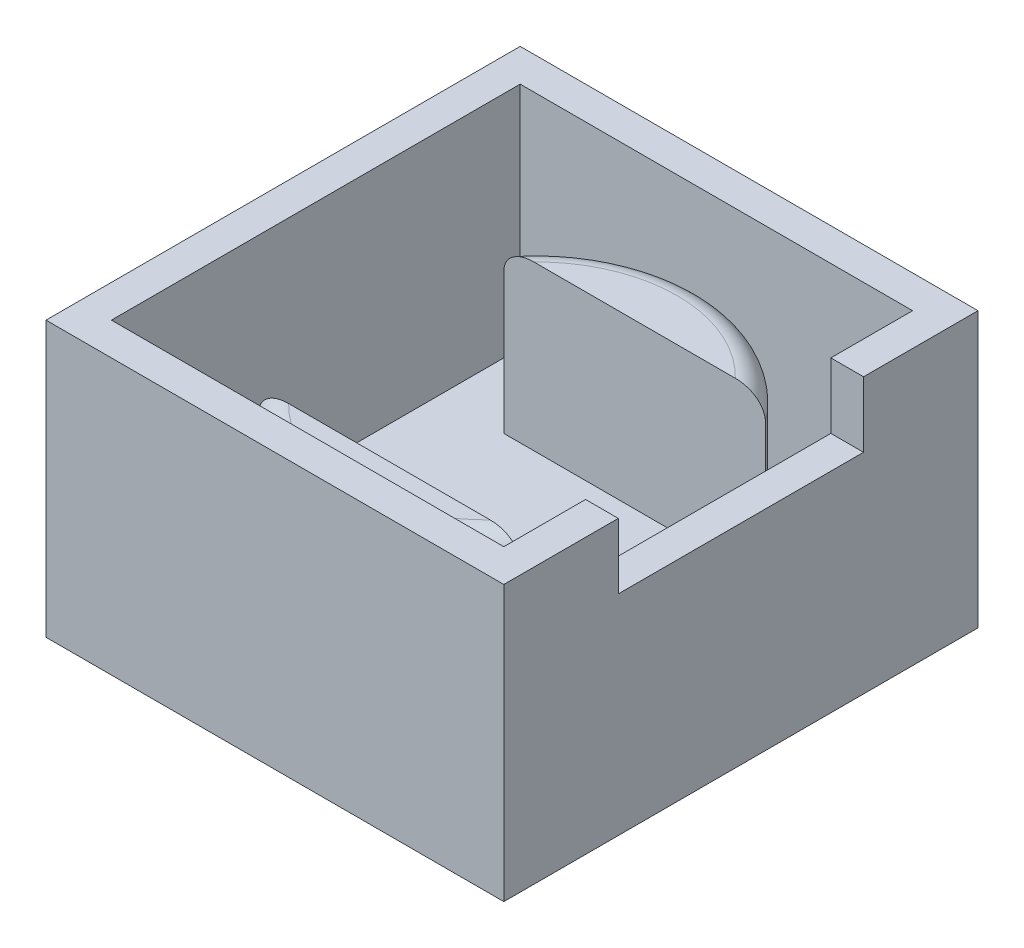
ISO-10303-21;
HEADER;
FILE_DESCRIPTION(('STEP AP214'),'2;1');
FILE_NAME('part.step','',(''),(''),'','','');
FILE_SCHEMA(('AUTOMOTIVE_DESIGN { 1 0 10303 214 1 1 1 1 }'));
ENDSEC;
DATA;
#1=APPLICATION_CONTEXT('core data for automotive mechanical design processes');
#2=APPLICATION_PROTOCOL_DEFINITION('international standard','automotive_design',2000,#1);
#3=PRODUCT_CONTEXT('',#1,'mechanical');
#4=PRODUCT('Part','Part','',(#3));
#5=PRODUCT_RELATED_PRODUCT_CATEGORY('part','',(#4));
#6=PRODUCT_DEFINITION_FORMATION('','',#4);
#7=PRODUCT_DEFINITION_CONTEXT('part definition',#1,'design');
#8=PRODUCT_DEFINITION('design','',#6,#7);
#9=PRODUCT_DEFINITION_SHAPE('','',#8);
#10=(LENGTH_UNIT() NAMED_UNIT(*) SI_UNIT(.MILLI.,.METRE.));
#11=(NAMED_UNIT(*) PLANE_ANGLE_UNIT() SI_UNIT($,.RADIAN.));
#12=(NAMED_UNIT(*) SI_UNIT($,.STERADIAN.) SOLID_ANGLE_UNIT());
#13=UNCERTAINTY_MEASURE_WITH_UNIT(LENGTH_MEASURE(1.E-05),#10,'distance_accuracy_value','');
#14=(GEOMETRIC_REPRESENTATION_CONTEXT(3) GLOBAL_UNCERTAINTY_ASSIGNED_CONTEXT((#13)) GLOBAL_UNIT_ASSIGNED_CONTEXT((#10,
#11,#12)) REPRESENTATION_CONTEXT('',''));
#15=CARTESIAN_POINT('',(0.,0.,0.));
#16=DIRECTION('',(0.,0.,1.));
#17=DIRECTION('',(1.,0.,0.));
#18=AXIS2_PLACEMENT_3D('',#15,#16,#17);
#19=CARTESIAN_POINT('',(0.,16.256,0.));
#20=DIRECTION('',(0.,-1.,0.));
#21=DIRECTION('',(0.,0.,-1.));
#22=AXIS2_PLACEMENT_3D('',#19,#20,#21);
#23=PLANE('',#22);
#24=DIRECTION('',(-1.,0.,0.));
#25=VECTOR('',#24,1.);
#26=CARTESIAN_POINT('',(66.04,16.256,31.75));
#27=LINE('',#26,#25);
#28=CARTESIAN_POINT('',(68.58,16.256,31.75));
#29=VERTEX_POINT('',#28);
#30=CARTESIAN_POINT('',(66.04,16.256,31.75));
#31=VERTEX_POINT('',#30);
#32=EDGE_CURVE('E54',#29,#31,#27,.T.);
#33=ORIENTED_EDGE('',*,*,#32,.F.);
#34=DIRECTION('',(0.,0.,-1.));
#35=VECTOR('',#34,1.);
#36=CARTESIAN_POINT('',(68.58,16.256,3.80999999999999));
#37=LINE('',#36,#35);
#38=CARTESIAN_POINT('',(68.58,16.256,12.7));
#39=VERTEX_POINT('',#38);
#40=EDGE_CURVE('E220',#29,#39,#37,.T.);
#41=ORIENTED_EDGE('',*,*,#40,.T.);
#42=DIRECTION('',(1.,0.,0.));
#43=VECTOR('',#42,1.);
#44=CARTESIAN_POINT('',(66.04,16.256,12.7));
#45=LINE('',#44,#43);
#46=CARTESIAN_POINT('',(66.0399999999999,16.256,12.7));
#47=VERTEX_POINT('',#46);
#48=EDGE_CURVE('E59',#47,#39,#45,.T.);
#49=ORIENTED_EDGE('',*,*,#48,.F.);
#50=DIRECTION('',(0.,0.,-1.));
#51=VECTOR('',#50,1.);
#52=CARTESIAN_POINT('',(66.04,16.256,38.1));
#53=LINE('',#52,#51);
#54=EDGE_CURVE('E294',#31,#47,#53,.T.);
#55=ORIENTED_EDGE('',*,*,#54,.F.);
#56=EDGE_LOOP('',(#33,#41,#49,#55));
#57=FACE_BOUND('',#56,.T.);
#58=ADVANCED_FACE('F36',(#57),#23,.F.);
#59=CARTESIAN_POINT('',(0.,3.556,0.));
#60=DIRECTION('',(0.,-1.,0.));
#61=DIRECTION('',(0.,0.,-1.));
#62=AXIS2_PLACEMENT_3D('',#59,#60,#61);
#63=PLANE('',#62);
#64=DIRECTION('',(-1.,0.,0.));
#65=VECTOR('',#64,1.);
#66=CARTESIAN_POINT('',(66.04,3.556,31.75));
#67=LINE('',#66,#65);
#68=CARTESIAN_POINT('',(60.96,3.556,31.75));
#69=VERTEX_POINT('',#68);
#70=CARTESIAN_POINT('',(40.64,3.556,31.75));
#71=VERTEX_POINT('',#70);
#72=EDGE_CURVE('E252',#69,#71,#67,.T.);
#73=ORIENTED_EDGE('',*,*,#72,.F.);
#74=CARTESIAN_POINT('',(50.8,3.556,24.13));
#75=DIRECTION('',(0.,1.,0.));
#76=DIRECTION('',(0.,0.,-1.));
#77=AXIS2_PLACEMENT_3D('',#74,#75,#76);
#78=CIRCLE('',#77,12.7);
#79=EDGE_CURVE('E249',#69,#71,#78,.F.);
#80=ORIENTED_EDGE('',*,*,#79,.T.);
#81=EDGE_LOOP('',(#73,#80));
#82=FACE_BOUND('',#81,.T.);
#83=DIRECTION('',(0.,0.,1.));
#84=VECTOR('',#83,1.);
#85=CARTESIAN_POINT('',(35.56,3.556,6.34999999999999));
#86=LINE('',#85,#84);
#87=CARTESIAN_POINT('',(35.56,3.556,6.34999999999999));
#88=VERTEX_POINT('',#87);
#89=CARTESIAN_POINT('',(35.56,3.556,38.1));
#90=VERTEX_POINT('',#89);
#91=EDGE_CURVE('E168',#88,#90,#86,.T.);
#92=ORIENTED_EDGE('',*,*,#91,.T.);
#93=DIRECTION('',(1.,0.,0.));
#94=VECTOR('',#93,1.);
#95=CARTESIAN_POINT('',(35.56,3.556,38.1));
#96=LINE('',#95,#94);
#97=CARTESIAN_POINT('',(66.04,3.556,38.1));
#98=VERTEX_POINT('',#97);
#99=EDGE_CURVE('E290',#90,#98,#96,.T.);
#100=ORIENTED_EDGE('',*,*,#99,.T.);
#101=DIRECTION('',(0.,0.,-1.));
#102=VECTOR('',#101,1.);
#103=CARTESIAN_POINT('',(66.04,3.556,10.922));
#104=LINE('',#103,#102);
#105=CARTESIAN_POINT('',(66.04,3.556,6.34999999999999));
#106=VERTEX_POINT('',#105);
#107=EDGE_CURVE('E400',#98,#106,#104,.T.);
#108=ORIENTED_EDGE('',*,*,#107,.T.);
#109=DIRECTION('',(-1.,0.,0.));
#110=VECTOR('',#109,1.);
#111=CARTESIAN_POINT('',(66.04,3.556,6.34999999999999));
#112=LINE('',#111,#110);
#113=EDGE_CURVE('E399',#106,#88,#112,.T.);
#114=ORIENTED_EDGE('',*,*,#113,.T.);
#115=EDGE_LOOP('',(#92,#100,#108,#114));
#116=FACE_BOUND('',#115,.T.);
#117=CARTESIAN_POINT('',(50.8,3.556,20.32));
#118=DIRECTION('',(0.,1.,0.));
#119=DIRECTION('',(0.,0.,-1.));
#120=AXIS2_PLACEMENT_3D('',#117,#118,#119);
#121=CIRCLE('',#120,12.7);
#122=CARTESIAN_POINT('',(60.96,3.556,12.7));
#123=VERTEX_POINT('',#122);
#124=CARTESIAN_POINT('',(40.64,3.556,12.7));
#125=VERTEX_POINT('',#124);
#126=EDGE_CURVE('E282',#123,#125,#121,.T.);
#127=ORIENTED_EDGE('',*,*,#126,.F.);
#128=DIRECTION('',(-1.,0.,0.));
#129=VECTOR('',#128,1.);
#130=CARTESIAN_POINT('',(66.04,3.556,12.7));
#131=LINE('',#130,#129);
#132=EDGE_CURVE('E277',#123,#125,#131,.T.);
#133=ORIENTED_EDGE('',*,*,#132,.T.);
#134=EDGE_LOOP('',(#127,#133));
#135=FACE_BOUND('',#134,.T.);
#136=ADVANCED_FACE('F326',(#82,#116,#135),#63,.F.);
#137=CARTESIAN_POINT('',(35.56,16.256,38.1));
#138=DIRECTION('',(0.,0.,-1.));
#139=DIRECTION('',(-1.,0.,0.));
#140=AXIS2_PLACEMENT_3D('',#137,#138,#139);
#141=PLANE('',#140);
#142=ORIENTED_EDGE('',*,*,#99,.F.);
#143=DIRECTION('',(0.,-1.,0.));
#144=VECTOR('',#143,1.);
#145=CARTESIAN_POINT('',(35.56,16.256,38.1));
#146=LINE('',#145,#144);
#147=CARTESIAN_POINT('',(35.56,21.336,38.1));
#148=VERTEX_POINT('',#147);
#149=EDGE_CURVE('E173',#148,#90,#146,.T.);
#150=ORIENTED_EDGE('',*,*,#149,.F.);
#151=DIRECTION('',(-1.,0.,0.));
#152=VECTOR('',#151,1.);
#153=CARTESIAN_POINT('',(35.56,21.336,38.1));
#154=LINE('',#153,#152);
#155=CARTESIAN_POINT('',(66.04,21.336,38.1));
#156=VERTEX_POINT('',#155);
#157=EDGE_CURVE('E186',#156,#148,#154,.T.);
#158=ORIENTED_EDGE('',*,*,#157,.F.);
#159=DIRECTION('',(0.,-1.,0.));
#160=VECTOR('',#159,1.);
#161=CARTESIAN_POINT('',(66.04,16.256,38.1));
#162=LINE('',#161,#160);
#163=EDGE_CURVE('E392',#156,#98,#162,.T.);
#164=ORIENTED_EDGE('',*,*,#163,.T.);
#165=EDGE_LOOP('',(#142,#150,#158,#164));
#166=FACE_BOUND('',#165,.T.);
#167=ADVANCED_FACE('F322',(#166),#141,.T.);
#168=CARTESIAN_POINT('',(66.04,16.256,10.922));
#169=DIRECTION('',(-1.,0.,0.));
#170=DIRECTION('',(0.,0.,1.));
#171=AXIS2_PLACEMENT_3D('',#168,#169,#170);
#172=PLANE('',#171);
#173=ORIENTED_EDGE('',*,*,#107,.F.);
#174=ORIENTED_EDGE('',*,*,#163,.F.);
#175=DIRECTION('',(0.,0.,1.));
#176=VECTOR('',#175,1.);
#177=CARTESIAN_POINT('',(66.04,21.336,31.75));
#178=LINE('',#177,#176);
#179=CARTESIAN_POINT('',(66.04,21.336,31.75));
#180=VERTEX_POINT('',#179);
#181=EDGE_CURVE('E209',#180,#156,#178,.T.);
#182=ORIENTED_EDGE('',*,*,#181,.F.);
#183=DIRECTION('',(0.,-1.,0.));
#184=VECTOR('',#183,1.);
#185=CARTESIAN_POINT('',(66.04,21.336,31.75));
#186=LINE('',#185,#184);
#187=EDGE_CURVE('E212',#180,#31,#186,.T.);
#188=ORIENTED_EDGE('',*,*,#187,.T.);
#189=ORIENTED_EDGE('',*,*,#54,.T.);
#190=DIRECTION('',(0.,-1.,0.));
#191=VECTOR('',#190,1.);
#192=CARTESIAN_POINT('',(66.04,21.336,12.7));
#193=LINE('',#192,#191);
#194=CARTESIAN_POINT('',(66.04,21.336,12.7));
#195=VERTEX_POINT('',#194);
#196=EDGE_CURVE('E225',#195,#47,#193,.T.);
#197=ORIENTED_EDGE('',*,*,#196,.F.);
#198=DIRECTION('',(0.,0.,1.));
#199=VECTOR('',#198,1.);
#200=CARTESIAN_POINT('',(66.04,21.336,6.34999999999999));
#201=LINE('',#200,#199);
#202=CARTESIAN_POINT('',(66.04,21.336,6.34999999999999));
#203=VERTEX_POINT('',#202);
#204=EDGE_CURVE('E180',#203,#195,#201,.T.);
#205=ORIENTED_EDGE('',*,*,#204,.F.);
#206=DIRECTION('',(0.,-1.,0.));
#207=VECTOR('',#206,1.);
#208=CARTESIAN_POINT('',(66.04,16.256,6.34999999999999));
#209=LINE('',#208,#207);
#210=EDGE_CURVE('E172',#203,#106,#209,.T.);
#211=ORIENTED_EDGE('',*,*,#210,.T.);
#212=EDGE_LOOP('',(#173,#174,#182,#188,#189,#197,#205,#211));
#213=FACE_BOUND('',#212,.T.);
#214=ADVANCED_FACE('F319',(#213),#172,.T.);
#215=CARTESIAN_POINT('',(66.04,16.256,6.34999999999999));
#216=DIRECTION('',(0.,0.,1.));
#217=DIRECTION('',(1.,0.,0.));
#218=AXIS2_PLACEMENT_3D('',#215,#216,#217);
#219=PLANE('',#218);
#220=ORIENTED_EDGE('',*,*,#113,.F.);
#221=ORIENTED_EDGE('',*,*,#210,.F.);
#222=DIRECTION('',(1.,0.,0.));
#223=VECTOR('',#222,1.);
#224=CARTESIAN_POINT('',(35.56,21.336,6.34999999999999));
#225=LINE('',#224,#223);
#226=CARTESIAN_POINT('',(35.56,21.336,6.34999999999999));
#227=VERTEX_POINT('',#226);
#228=EDGE_CURVE('E176',#227,#203,#225,.T.);
#229=ORIENTED_EDGE('',*,*,#228,.F.);
#230=DIRECTION('',(0.,-1.,0.));
#231=VECTOR('',#230,1.);
#232=CARTESIAN_POINT('',(35.56,16.256,6.34999999999999));
#233=LINE('',#232,#231);
#234=EDGE_CURVE('E162',#227,#88,#233,.T.);
#235=ORIENTED_EDGE('',*,*,#234,.T.);
#236=EDGE_LOOP('',(#220,#221,#229,#235));
#237=FACE_BOUND('',#236,.T.);
#238=ADVANCED_FACE('F177',(#237),#219,.T.);
#239=CARTESIAN_POINT('',(35.56,16.256,6.34999999999999));
#240=DIRECTION('',(1.,0.,0.));
#241=DIRECTION('',(0.,0.,-1.));
#242=AXIS2_PLACEMENT_3D('',#239,#240,#241);
#243=PLANE('',#242);
#244=ORIENTED_EDGE('',*,*,#91,.F.);
#245=ORIENTED_EDGE('',*,*,#234,.F.);
#246=DIRECTION('',(0.,0.,-1.));
#247=VECTOR('',#246,1.);
#248=CARTESIAN_POINT('',(35.56,21.336,6.34999999999999));
#249=LINE('',#248,#247);
#250=EDGE_CURVE('E166',#148,#227,#249,.T.);
#251=ORIENTED_EDGE('',*,*,#250,.F.);
#252=ORIENTED_EDGE('',*,*,#149,.T.);
#253=EDGE_LOOP('',(#244,#245,#251,#252));
#254=FACE_BOUND('',#253,.T.);
#255=ADVANCED_FACE('F164',(#254),#243,.T.);
#256=CARTESIAN_POINT('',(66.04,16.256,12.7));
#257=DIRECTION('',(0.,0.,1.));
#258=DIRECTION('',(1.,0.,0.));
#259=AXIS2_PLACEMENT_3D('',#256,#257,#258);
#260=PLANE('',#259);
#261=DIRECTION('',(-1.,0.,0.));
#262=VECTOR('',#261,1.);
#263=CARTESIAN_POINT('',(66.04,16.256,12.7));
#264=LINE('',#263,#262);
#265=CARTESIAN_POINT('',(58.6246842747807,16.256,12.7));
#266=VERTEX_POINT('',#265);
#267=CARTESIAN_POINT('',(42.9753157252193,16.256,12.7));
#268=VERTEX_POINT('',#267);
#269=EDGE_CURVE('E278',#266,#268,#264,.T.);
#270=ORIENTED_EDGE('',*,*,#269,.T.);
#271=CARTESIAN_POINT('',(42.9753157252193,16.256,12.7));
#272=CARTESIAN_POINT('',(42.8260682215825,16.2559637567386,12.7));
#273=CARTESIAN_POINT('',(42.6763931279492,16.2463369178115,12.7));
#274=CARTESIAN_POINT('',(42.378749737809,16.2057112449425,12.7));
#275=CARTESIAN_POINT('',(42.2308063458745,16.1745335333477,12.7));
#276=CARTESIAN_POINT('',(41.9623744617059,16.0946606199065,12.7));
#277=CARTESIAN_POINT('',(41.8409737048409,16.0490873543272,12.7));
#278=CARTESIAN_POINT('',(41.6071171218616,15.9393615712505,12.7));
#279=CARTESIAN_POINT('',(41.4946351551072,15.8752661166794,12.7));
#280=CARTESIAN_POINT('',(41.3038680474718,15.7422735666558,12.7));
#281=CARTESIAN_POINT('',(41.2232067475889,15.6767958682705,12.7));
#282=CARTESIAN_POINT('',(41.0735835795358,15.5335090045033,12.7));
#283=CARTESIAN_POINT('',(41.0046145722599,15.4557074204159,12.7));
#284=CARTESIAN_POINT('',(40.8912161963294,15.3015507291466,12.7));
#285=CARTESIAN_POINT('',(40.8446507128296,15.2267704949525,12.7));
#286=CARTESIAN_POINT('',(40.7646589404127,15.0705427778291,12.7));
#287=CARTESIAN_POINT('',(40.7312127334993,14.9891056305391,12.7));
#288=CARTESIAN_POINT('',(40.6838261936955,14.8363675954861,12.7));
#289=CARTESIAN_POINT('',(40.6674859695718,14.7658122639089,12.7));
#290=CARTESIAN_POINT('',(40.6510449946302,14.6586725000791,12.7));
#291=CARTESIAN_POINT('',(40.6469094329416,14.6226742054632,12.7));
#292=CARTESIAN_POINT('',(40.6413850917166,14.5504548696761,12.7));
#293=CARTESIAN_POINT('',(40.6399972845918,14.5142337541972,12.7));
#294=CARTESIAN_POINT('',(40.64,14.478,12.7));
#295=B_SPLINE_CURVE_WITH_KNOTS('',3,(#271,#272,#273,#274,#275,#276,#277,#278,#279,#280,#281,
#282,#283,#284,#285,#286,#287,#288,#289,#290,#291,#292,#293,#294),.UNSPECIFIED.,.F.,.F.,(4,2,2,
2,2,2,2,2,2,2,2,4),(0.,0.448119763265353,0.900004412100302,1.28762233556798,1.67405859452323,
1.98454718114232,2.29484550077876,2.55801748531335,2.82078835492957,3.03721328479408,
3.14582497918451,3.25447510364535),.UNSPECIFIED.);
#296=CARTESIAN_POINT('',(40.64,14.478,12.7));
#297=VERTEX_POINT('',#296);
#298=EDGE_CURVE('E46',#268,#297,#295,.T.);
#299=ORIENTED_EDGE('',*,*,#298,.T.);
#300=DIRECTION('',(0.,-1.,0.));
#301=VECTOR('',#300,1.);
#302=CARTESIAN_POINT('',(40.64,16.256,12.7));
#303=LINE('',#302,#301);
#304=EDGE_CURVE('E281',#297,#125,#303,.T.);
#305=ORIENTED_EDGE('',*,*,#304,.T.);
#306=ORIENTED_EDGE('',*,*,#132,.F.);
#307=DIRECTION('',(0.,-1.,0.));
#308=VECTOR('',#307,1.);
#309=CARTESIAN_POINT('',(60.96,16.256,12.7));
#310=LINE('',#309,#308);
#311=CARTESIAN_POINT('',(60.96,14.478,12.7));
#312=VERTEX_POINT('',#311);
#313=EDGE_CURVE('E288',#312,#123,#310,.T.);
#314=ORIENTED_EDGE('',*,*,#313,.F.);
#315=CARTESIAN_POINT('',(60.96,14.478,12.7));
#316=CARTESIAN_POINT('',(60.9600098540012,14.5206174303124,12.7));
#317=CARTESIAN_POINT('',(60.958084956321,14.5632298889388,12.7));
#318=CARTESIAN_POINT('',(60.9504411469389,14.648095420689,12.7));
#319=CARTESIAN_POINT('',(60.9447238587689,14.6903486397678,12.7));
#320=CARTESIAN_POINT('',(60.9296113723054,14.7739579279236,12.7));
#321=CARTESIAN_POINT('',(60.9202361123419,14.8153175989796,12.7));
#322=CARTESIAN_POINT('',(60.8979536237045,14.8970644297317,12.7));
#323=CARTESIAN_POINT('',(60.8850461784527,14.9374515296289,12.7));
#324=CARTESIAN_POINT('',(60.8413146637587,15.0566281372766,12.7));
#325=CARTESIAN_POINT('',(60.8054462262807,15.1336223130733,12.7));
#326=CARTESIAN_POINT('',(60.722025395139,15.2809899628084,12.7));
#327=CARTESIAN_POINT('',(60.674459485028,15.3513556464929,12.7));
#328=CARTESIAN_POINT('',(60.5663688031459,15.4884932696151,12.7));
#329=CARTESIAN_POINT('',(60.5052257987793,15.5547760350645,12.7));
#330=CARTESIAN_POINT('',(60.3742828171599,15.6780282783103,12.7));
#331=CARTESIAN_POINT('',(60.3044822835314,15.7349971570044,12.7));
#332=CARTESIAN_POINT('',(60.1240247969313,15.8639571453315,12.7));
#333=CARTESIAN_POINT('',(60.0094992899908,15.9305571473271,12.7));
#334=CARTESIAN_POINT('',(59.7708708574614,16.0444293029755,12.7));
#335=CARTESIAN_POINT('',(59.6467300261933,16.0916197952112,12.7));
#336=CARTESIAN_POINT('',(59.3743706966972,16.1733572133166,12.7));
#337=CARTESIAN_POINT('',(59.2253009143743,16.2050139385271,12.7));
#338=CARTESIAN_POINT('',(58.9255492926936,16.2462115182669,12.7));
#339=CARTESIAN_POINT('',(58.7748970997914,16.2559638395076,12.7));
#340=CARTESIAN_POINT('',(58.6246842747807,16.256,12.7));
#341=B_SPLINE_CURVE_WITH_KNOTS('',3,(#315,#316,#317,#318,#319,#320,#321,#322,#323,#324,#325,
#326,#327,#328,#329,#330,#331,#332,#333,#334,#335,#336,#337,#338,#339,#340),.UNSPECIFIED.,.F.,
.F.,(4,2,2,2,2,2,2,2,2,2,2,2,4),(0.,0.127800600711071,0.255546524946128,0.382605664968205,
0.50967259743684,0.763236158847247,1.01709410147358,1.28660609390774,1.55613541549619,
1.9514092329977,2.34832947734815,2.80377433538383,3.25480304429581),.UNSPECIFIED.);
#342=EDGE_CURVE('E301',#312,#266,#341,.T.);
#343=ORIENTED_EDGE('',*,*,#342,.T.);
#344=EDGE_LOOP('',(#270,#299,#305,#306,#314,#343));
#345=FACE_BOUND('',#344,.T.);
#346=ADVANCED_FACE('F306',(#345),#260,.T.);
#347=CARTESIAN_POINT('',(50.8,16.256,20.32));
#348=DIRECTION('',(0.,-1.,0.));
#349=DIRECTION('',(0.,0.,-1.));
#350=AXIS2_PLACEMENT_3D('',#347,#348,#349);
#351=CYLINDRICAL_SURFACE('',#350,12.7);
#352=ORIENTED_EDGE('',*,*,#304,.F.);
#353=CARTESIAN_POINT('',(50.8,14.478,20.32));
#354=DIRECTION('',(0.,1.,0.));
#355=DIRECTION('',(0.,0.,1.));
#356=AXIS2_PLACEMENT_3D('',#353,#354,#355);
#357=CIRCLE('',#356,12.7);
#358=EDGE_CURVE('E11',#297,#312,#357,.F.);
#359=ORIENTED_EDGE('',*,*,#358,.T.);
#360=ORIENTED_EDGE('',*,*,#313,.T.);
#361=ORIENTED_EDGE('',*,*,#126,.T.);
#362=EDGE_LOOP('',(#352,#359,#360,#361));
#363=FACE_BOUND('',#362,.T.);
#364=ADVANCED_FACE('F311',(#363),#351,.T.);
#365=CARTESIAN_POINT('',(66.04,16.256,6.34999999999999));
#366=DIRECTION('',(0.,1.,0.));
#367=DIRECTION('',(0.,0.,-1.));
#368=AXIS2_PLACEMENT_3D('',#365,#366,#367);
#369=PLANE('',#368);
#370=ORIENTED_EDGE('',*,*,#269,.F.);
#371=CARTESIAN_POINT('',(50.8,16.256,20.32));
#372=DIRECTION('',(0.,1.,0.));
#373=DIRECTION('',(0.,0.,1.));
#374=AXIS2_PLACEMENT_3D('',#371,#372,#373);
#375=CIRCLE('',#374,10.922);
#376=EDGE_CURVE('E379',#266,#268,#375,.T.);
#377=ORIENTED_EDGE('',*,*,#376,.T.);
#378=EDGE_LOOP('',(#370,#377));
#379=FACE_BOUND('',#378,.T.);
#380=ADVANCED_FACE('F368',(#379),#369,.T.);
#381=CARTESIAN_POINT('',(50.8,16.256,24.13));
#382=DIRECTION('',(0.,-1.,0.));
#383=DIRECTION('',(0.,0.,-1.));
#384=AXIS2_PLACEMENT_3D('',#381,#382,#383);
#385=CYLINDRICAL_SURFACE('',#384,12.7);
#386=DIRECTION('',(0.,-1.,0.));
#387=VECTOR('',#386,1.);
#388=CARTESIAN_POINT('',(60.96,16.256,31.75));
#389=LINE('',#388,#387);
#390=CARTESIAN_POINT('',(60.96,14.478,31.75));
#391=VERTEX_POINT('',#390);
#392=EDGE_CURVE('E275',#391,#69,#389,.T.);
#393=ORIENTED_EDGE('',*,*,#392,.F.);
#394=CARTESIAN_POINT('',(50.8,14.478,24.13));
#395=DIRECTION('',(0.,1.,0.));
#396=DIRECTION('',(0.,0.,1.));
#397=AXIS2_PLACEMENT_3D('',#394,#395,#396);
#398=CIRCLE('',#397,12.7);
#399=CARTESIAN_POINT('',(40.64,14.478,31.75));
#400=VERTEX_POINT('',#399);
#401=EDGE_CURVE('E391',#391,#400,#398,.F.);
#402=ORIENTED_EDGE('',*,*,#401,.T.);
#403=DIRECTION('',(0.,-1.,0.));
#404=VECTOR('',#403,1.);
#405=CARTESIAN_POINT('',(40.64,16.256,31.75));
#406=LINE('',#405,#404);
#407=EDGE_CURVE('E270',#400,#71,#406,.T.);
#408=ORIENTED_EDGE('',*,*,#407,.T.);
#409=ORIENTED_EDGE('',*,*,#79,.F.);
#410=EDGE_LOOP('',(#393,#402,#408,#409));
#411=FACE_BOUND('',#410,.T.);
#412=ADVANCED_FACE('F363',(#411),#385,.T.);
#413=CARTESIAN_POINT('',(66.04,16.256,31.75));
#414=DIRECTION('',(0.,0.,1.));
#415=DIRECTION('',(1.,0.,0.));
#416=AXIS2_PLACEMENT_3D('',#413,#414,#415);
#417=PLANE('',#416);
#418=ORIENTED_EDGE('',*,*,#407,.F.);
#419=CARTESIAN_POINT('',(40.64,14.478,31.75));
#420=CARTESIAN_POINT('',(40.6399901459988,14.5206174303124,31.75));
#421=CARTESIAN_POINT('',(40.641915043679,14.5632298889388,31.75));
#422=CARTESIAN_POINT('',(40.6495588530611,14.648095420689,31.75));
#423=CARTESIAN_POINT('',(40.6552761412312,14.6903486397678,31.75));
#424=CARTESIAN_POINT('',(40.6703886276946,14.7739579279236,31.75));
#425=CARTESIAN_POINT('',(40.6797638876581,14.8153175989796,31.75));
#426=CARTESIAN_POINT('',(40.7020463762955,14.8970644297317,31.75));
#427=CARTESIAN_POINT('',(40.7149538215473,14.9374515296289,31.75));
#428=CARTESIAN_POINT('',(40.7586853362413,15.0566281372766,31.75));
#429=CARTESIAN_POINT('',(40.7945537737193,15.1336223130733,31.75));
#430=CARTESIAN_POINT('',(40.877974604861,15.2809899628084,31.75));
#431=CARTESIAN_POINT('',(40.925540514972,15.3513556464929,31.75));
#432=CARTESIAN_POINT('',(41.0336311968541,15.4884932696151,31.75));
#433=CARTESIAN_POINT('',(41.0947742012207,15.5547760350645,31.75));
#434=CARTESIAN_POINT('',(41.2257171828401,15.6780282783103,31.75));
#435=CARTESIAN_POINT('',(41.2955177164686,15.7349971570044,31.75));
#436=CARTESIAN_POINT('',(41.4759752030687,15.8639571453315,31.75));
#437=CARTESIAN_POINT('',(41.5905007100092,15.9305571473271,31.75));
#438=CARTESIAN_POINT('',(41.8291291425386,16.0444293029755,31.75));
#439=CARTESIAN_POINT('',(41.9532699738067,16.0916197952112,31.75));
#440=CARTESIAN_POINT('',(42.2256293033028,16.1733572133166,31.75));
#441=CARTESIAN_POINT('',(42.3746990856257,16.2050139385271,31.75));
#442=CARTESIAN_POINT('',(42.6744507073064,16.2462115182669,31.75));
#443=CARTESIAN_POINT('',(42.8251029002087,16.2559638395076,31.75));
#444=CARTESIAN_POINT('',(42.9753157252193,16.256,31.75));
#445=B_SPLINE_CURVE_WITH_KNOTS('',3,(#419,#420,#421,#422,#423,#424,#425,#426,#427,#428,#429,
#430,#431,#432,#433,#434,#435,#436,#437,#438,#439,#440,#441,#442,#443,#444),.UNSPECIFIED.,.F.,
.F.,(4,2,2,2,2,2,2,2,2,2,2,2,4),(0.,0.127800600711069,0.255546524946129,0.38260566496821,
0.50967259743684,0.763236158847241,1.01709410147359,1.28660609390774,1.55613541549619,
1.95140923299771,2.34832947734817,2.80377433538384,3.2548030442958),.UNSPECIFIED.);
#446=CARTESIAN_POINT('',(42.9753157252193,16.256,31.75));
#447=VERTEX_POINT('',#446);
#448=EDGE_CURVE('E352',#400,#447,#445,.T.);
#449=ORIENTED_EDGE('',*,*,#448,.T.);
#450=DIRECTION('',(-1.,0.,0.));
#451=VECTOR('',#450,1.);
#452=CARTESIAN_POINT('',(66.04,16.256,31.75));
#453=LINE('',#452,#451);
#454=CARTESIAN_POINT('',(58.6246842747807,16.256,31.75));
#455=VERTEX_POINT('',#454);
#456=EDGE_CURVE('E268',#455,#447,#453,.T.);
#457=ORIENTED_EDGE('',*,*,#456,.F.);
#458=CARTESIAN_POINT('',(58.6246842747807,16.256,31.75));
#459=CARTESIAN_POINT('',(58.7739317784175,16.2559637567386,31.75));
#460=CARTESIAN_POINT('',(58.9236068720508,16.2463369178115,31.75));
#461=CARTESIAN_POINT('',(59.221250262191,16.2057112449425,31.75));
#462=CARTESIAN_POINT('',(59.3691936541255,16.1745335333477,31.75));
#463=CARTESIAN_POINT('',(59.6376255382941,16.0946606199065,31.75));
#464=CARTESIAN_POINT('',(59.7590262951591,16.0490873543272,31.75));
#465=CARTESIAN_POINT('',(59.9928828781384,15.9393615712505,31.75));
#466=CARTESIAN_POINT('',(60.1053648448928,15.8752661166794,31.75));
#467=CARTESIAN_POINT('',(60.2961319525282,15.7422735666558,31.75));
#468=CARTESIAN_POINT('',(60.3767932524111,15.6767958682705,31.75));
#469=CARTESIAN_POINT('',(60.5264164204642,15.5335090045033,31.75));
#470=CARTESIAN_POINT('',(60.5953854277401,15.4557074204159,31.75));
#471=CARTESIAN_POINT('',(60.7087838036706,15.3015507291466,31.75));
#472=CARTESIAN_POINT('',(60.7553492871704,15.2267704949525,31.75));
#473=CARTESIAN_POINT('',(60.8353410595873,15.0705427778291,31.75));
#474=CARTESIAN_POINT('',(60.8687872665007,14.9891056305391,31.75));
#475=CARTESIAN_POINT('',(60.9161738063045,14.8363675954861,31.75));
#476=CARTESIAN_POINT('',(60.9325140304282,14.7658122639089,31.75));
#477=CARTESIAN_POINT('',(60.9489550053698,14.6586725000791,31.75));
#478=CARTESIAN_POINT('',(60.9530905670584,14.6226742054632,31.75));
#479=CARTESIAN_POINT('',(60.9586149082834,14.5504548696761,31.75));
#480=CARTESIAN_POINT('',(60.9600027154082,14.5142337541972,31.75));
#481=CARTESIAN_POINT('',(60.96,14.478,31.75));
#482=B_SPLINE_CURVE_WITH_KNOTS('',3,(#458,#459,#460,#461,#462,#463,#464,#465,#466,#467,#468,
#469,#470,#471,#472,#473,#474,#475,#476,#477,#478,#479,#480,#481),.UNSPECIFIED.,.F.,.F.,(4,2,2,
2,2,2,2,2,2,2,2,4),(0.,0.448119763265353,0.900004412100302,1.28762233556798,1.67405859452322,
1.98454718114232,2.29484550077876,2.55801748531334,2.82078835492957,3.03721328479407,
3.1458249791845,3.25447510364535),.UNSPECIFIED.);
#483=EDGE_CURVE('E345',#455,#391,#482,.T.);
#484=ORIENTED_EDGE('',*,*,#483,.T.);
#485=ORIENTED_EDGE('',*,*,#392,.T.);
#486=ORIENTED_EDGE('',*,*,#72,.T.);
#487=EDGE_LOOP('',(#418,#449,#457,#484,#485,#486));
#488=FACE_BOUND('',#487,.T.);
#489=ADVANCED_FACE('F358',(#488),#417,.F.);
#490=CARTESIAN_POINT('',(66.04,16.256,6.34999999999999));
#491=DIRECTION('',(0.,1.,0.));
#492=DIRECTION('',(0.,0.,-1.));
#493=AXIS2_PLACEMENT_3D('',#490,#491,#492);
#494=PLANE('',#493);
#495=ORIENTED_EDGE('',*,*,#456,.T.);
#496=CARTESIAN_POINT('',(50.8,16.256,24.13));
#497=DIRECTION('',(0.,1.,0.));
#498=DIRECTION('',(0.,0.,1.));
#499=AXIS2_PLACEMENT_3D('',#496,#497,#498);
#500=CIRCLE('',#499,10.922);
#501=EDGE_CURVE('E357',#447,#455,#500,.T.);
#502=ORIENTED_EDGE('',*,*,#501,.T.);
#503=EDGE_LOOP('',(#495,#502));
#504=FACE_BOUND('',#503,.T.);
#505=ADVANCED_FACE('F341',(#504),#494,.T.);
#506=CARTESIAN_POINT('',(50.8,14.478,24.13));
#507=DIRECTION('',(0.,1.,0.));
#508=DIRECTION('',(0.,0.,1.));
#509=AXIS2_PLACEMENT_3D('',#506,#507,#508);
#510=TOROIDAL_SURFACE('',#509,10.922,1.778);
#511=ORIENTED_EDGE('',*,*,#483,.F.);
#512=ORIENTED_EDGE('',*,*,#501,.F.);
#513=ORIENTED_EDGE('',*,*,#448,.F.);
#514=ORIENTED_EDGE('',*,*,#401,.F.);
#515=EDGE_LOOP('',(#511,#512,#513,#514));
#516=FACE_BOUND('',#515,.T.);
#517=ADVANCED_FACE('F338',(#516),#510,.T.);
#518=CARTESIAN_POINT('',(50.8,14.478,20.32));
#519=DIRECTION('',(0.,1.,0.));
#520=DIRECTION('',(0.,0.,1.));
#521=AXIS2_PLACEMENT_3D('',#518,#519,#520);
#522=TOROIDAL_SURFACE('',#521,10.922,1.778);
#523=ORIENTED_EDGE('',*,*,#342,.F.);
#524=ORIENTED_EDGE('',*,*,#358,.F.);
#525=ORIENTED_EDGE('',*,*,#298,.F.);
#526=ORIENTED_EDGE('',*,*,#376,.F.);
#527=EDGE_LOOP('',(#523,#524,#525,#526));
#528=FACE_BOUND('',#527,.T.);
#529=ADVANCED_FACE('F38',(#528),#522,.T.);
#530=CARTESIAN_POINT('',(33.02,-51.1953367016958,3.80999999999999));
#531=DIRECTION('',(0.,0.,-1.));
#532=DIRECTION('',(-1.,0.,0.));
#533=AXIS2_PLACEMENT_3D('',#530,#531,#532);
#534=PLANE('',#533);
#535=DIRECTION('',(0.,1.,0.));
#536=VECTOR('',#535,1.);
#537=CARTESIAN_POINT('',(68.58,-51.1953367016958,3.80999999999999));
#538=LINE('',#537,#536);
#539=CARTESIAN_POINT('',(68.58,0.,3.80999999999999));
#540=VERTEX_POINT('',#539);
#541=CARTESIAN_POINT('',(68.58,21.336,3.80999999999999));
#542=VERTEX_POINT('',#541);
#543=EDGE_CURVE('E415',#540,#542,#538,.T.);
#544=ORIENTED_EDGE('',*,*,#543,.F.);
#545=DIRECTION('',(-1.,0.,0.));
#546=VECTOR('',#545,1.);
#547=CARTESIAN_POINT('',(33.02,0.,3.80999999999999));
#548=LINE('',#547,#546);
#549=CARTESIAN_POINT('',(33.02,0.,3.80999999999999));
#550=VERTEX_POINT('',#549);
#551=EDGE_CURVE('E231',#540,#550,#548,.T.);
#552=ORIENTED_EDGE('',*,*,#551,.T.);
#553=DIRECTION('',(0.,1.,0.));
#554=VECTOR('',#553,1.);
#555=CARTESIAN_POINT('',(33.02,-51.1953367016958,3.80999999999999));
#556=LINE('',#555,#554);
#557=CARTESIAN_POINT('',(33.02,21.336,3.80999999999999));
#558=VERTEX_POINT('',#557);
#559=EDGE_CURVE('E265',#550,#558,#556,.T.);
#560=ORIENTED_EDGE('',*,*,#559,.T.);
#561=DIRECTION('',(-1.,0.,0.));
#562=VECTOR('',#561,1.);
#563=CARTESIAN_POINT('',(68.58,21.336,3.80999999999999));
#564=LINE('',#563,#562);
#565=EDGE_CURVE('E196',#542,#558,#564,.T.);
#566=ORIENTED_EDGE('',*,*,#565,.F.);
#567=EDGE_LOOP('',(#544,#552,#560,#566));
#568=FACE_BOUND('',#567,.T.);
#569=ADVANCED_FACE('F413',(#568),#534,.T.);
#570=CARTESIAN_POINT('',(68.58,-51.1953367016958,3.80999999999999));
#571=DIRECTION('',(1.,0.,0.));
#572=DIRECTION('',(0.,0.,-1.));
#573=AXIS2_PLACEMENT_3D('',#570,#571,#572);
#574=PLANE('',#573);
#575=DIRECTION('',(0.,1.,0.));
#576=VECTOR('',#575,1.);
#577=CARTESIAN_POINT('',(68.58,-51.1953367016958,40.64));
#578=LINE('',#577,#576);
#579=CARTESIAN_POINT('',(68.58,0.,40.64));
#580=VERTEX_POINT('',#579);
#581=CARTESIAN_POINT('',(68.58,21.336,40.64));
#582=VERTEX_POINT('',#581);
#583=EDGE_CURVE('E260',#580,#582,#578,.T.);
#584=ORIENTED_EDGE('',*,*,#583,.F.);
#585=DIRECTION('',(0.,0.,-1.));
#586=VECTOR('',#585,1.);
#587=CARTESIAN_POINT('',(68.58,0.,3.80999999999999));
#588=LINE('',#587,#586);
#589=EDGE_CURVE('E267',#580,#540,#588,.T.);
#590=ORIENTED_EDGE('',*,*,#589,.T.);
#591=ORIENTED_EDGE('',*,*,#543,.T.);
#592=DIRECTION('',(0.,0.,-1.));
#593=VECTOR('',#592,1.);
#594=CARTESIAN_POINT('',(68.58,21.336,12.7));
#595=LINE('',#594,#593);
#596=CARTESIAN_POINT('',(68.58,21.336,12.7));
#597=VERTEX_POINT('',#596);
#598=EDGE_CURVE('E193',#597,#542,#595,.T.);
#599=ORIENTED_EDGE('',*,*,#598,.F.);
#600=DIRECTION('',(0.,-1.,0.));
#601=VECTOR('',#600,1.);
#602=CARTESIAN_POINT('',(68.58,21.336,12.7));
#603=LINE('',#602,#601);
#604=EDGE_CURVE('E222',#597,#39,#603,.T.);
#605=ORIENTED_EDGE('',*,*,#604,.T.);
#606=ORIENTED_EDGE('',*,*,#40,.F.);
#607=DIRECTION('',(0.,-1.,0.));
#608=VECTOR('',#607,1.);
#609=CARTESIAN_POINT('',(68.58,21.336,31.75));
#610=LINE('',#609,#608);
#611=CARTESIAN_POINT('',(68.58,21.336,31.75));
#612=VERTEX_POINT('',#611);
#613=EDGE_CURVE('E226',#612,#29,#610,.T.);
#614=ORIENTED_EDGE('',*,*,#613,.F.);
#615=DIRECTION('',(0.,0.,-1.));
#616=VECTOR('',#615,1.);
#617=CARTESIAN_POINT('',(68.58,21.336,40.64));
#618=LINE('',#617,#616);
#619=EDGE_CURVE('E205',#582,#612,#618,.T.);
#620=ORIENTED_EDGE('',*,*,#619,.F.);
#621=EDGE_LOOP('',(#584,#590,#591,#599,#605,#606,#614,#620));
#622=FACE_BOUND('',#621,.T.);
#623=ADVANCED_FACE('F246',(#622),#574,.T.);
#624=CARTESIAN_POINT('',(33.02,-51.1953367016958,40.64));
#625=DIRECTION('',(0.,0.,1.));
#626=DIRECTION('',(1.,0.,0.));
#627=AXIS2_PLACEMENT_3D('',#624,#625,#626);
#628=PLANE('',#627);
#629=DIRECTION('',(0.,1.,0.));
#630=VECTOR('',#629,1.);
#631=CARTESIAN_POINT('',(33.02,-51.1953367016958,40.64));
#632=LINE('',#631,#630);
#633=CARTESIAN_POINT('',(33.02,0.,40.64));
#634=VERTEX_POINT('',#633);
#635=CARTESIAN_POINT('',(33.02,21.336,40.64));
#636=VERTEX_POINT('',#635);
#637=EDGE_CURVE('E250',#634,#636,#632,.T.);
#638=ORIENTED_EDGE('',*,*,#637,.F.);
#639=DIRECTION('',(1.,0.,0.));
#640=VECTOR('',#639,1.);
#641=CARTESIAN_POINT('',(33.02,0.,40.64));
#642=LINE('',#641,#640);
#643=EDGE_CURVE('E422',#634,#580,#642,.T.);
#644=ORIENTED_EDGE('',*,*,#643,.T.);
#645=ORIENTED_EDGE('',*,*,#583,.T.);
#646=DIRECTION('',(1.,0.,0.));
#647=VECTOR('',#646,1.);
#648=CARTESIAN_POINT('',(68.58,21.336,40.64));
#649=LINE('',#648,#647);
#650=EDGE_CURVE('E202',#636,#582,#649,.T.);
#651=ORIENTED_EDGE('',*,*,#650,.F.);
#652=EDGE_LOOP('',(#638,#644,#645,#651));
#653=FACE_BOUND('',#652,.T.);
#654=ADVANCED_FACE('F420',(#653),#628,.T.);
#655=CARTESIAN_POINT('',(33.02,-51.1953367016958,3.80999999999999));
#656=DIRECTION('',(-1.,0.,0.));
#657=DIRECTION('',(0.,0.,1.));
#658=AXIS2_PLACEMENT_3D('',#655,#656,#657);
#659=PLANE('',#658);
#660=ORIENTED_EDGE('',*,*,#559,.F.);
#661=DIRECTION('',(0.,0.,1.));
#662=VECTOR('',#661,1.);
#663=CARTESIAN_POINT('',(33.02,0.,3.80999999999999));
#664=LINE('',#663,#662);
#665=EDGE_CURVE('E254',#550,#634,#664,.T.);
#666=ORIENTED_EDGE('',*,*,#665,.T.);
#667=ORIENTED_EDGE('',*,*,#637,.T.);
#668=DIRECTION('',(0.,0.,1.));
#669=VECTOR('',#668,1.);
#670=CARTESIAN_POINT('',(33.02,21.336,40.64));
#671=LINE('',#670,#669);
#672=EDGE_CURVE('E199',#558,#636,#671,.T.);
#673=ORIENTED_EDGE('',*,*,#672,.F.);
#674=EDGE_LOOP('',(#660,#666,#667,#673));
#675=FACE_BOUND('',#674,.T.);
#676=ADVANCED_FACE('F336',(#675),#659,.T.);
#677=CARTESIAN_POINT('',(0.,0.,0.));
#678=DIRECTION('',(0.,-1.,0.));
#679=DIRECTION('',(0.,0.,-1.));
#680=AXIS2_PLACEMENT_3D('',#677,#678,#679);
#681=PLANE('',#680);
#682=ORIENTED_EDGE('',*,*,#551,.F.);
#683=ORIENTED_EDGE('',*,*,#589,.F.);
#684=ORIENTED_EDGE('',*,*,#643,.F.);
#685=ORIENTED_EDGE('',*,*,#665,.F.);
#686=EDGE_LOOP('',(#682,#683,#684,#685));
#687=FACE_BOUND('',#686,.T.);
#688=ADVANCED_FACE('F333',(#687),#681,.T.);
#689=CARTESIAN_POINT('',(66.04,21.336,12.7));
#690=DIRECTION('',(0.,0.,-1.));
#691=DIRECTION('',(-1.,0.,0.));
#692=AXIS2_PLACEMENT_3D('',#689,#690,#691);
#693=PLANE('',#692);
#694=ORIENTED_EDGE('',*,*,#48,.T.);
#695=ORIENTED_EDGE('',*,*,#604,.F.);
#696=DIRECTION('',(1.,0.,0.));
#697=VECTOR('',#696,1.);
#698=CARTESIAN_POINT('',(66.04,21.336,12.7));
#699=LINE('',#698,#697);
#700=EDGE_CURVE('E191',#195,#597,#699,.T.);
#701=ORIENTED_EDGE('',*,*,#700,.F.);
#702=ORIENTED_EDGE('',*,*,#196,.T.);
#703=EDGE_LOOP('',(#694,#695,#701,#702));
#704=FACE_BOUND('',#703,.T.);
#705=ADVANCED_FACE('F335',(#704),#693,.F.);
#706=CARTESIAN_POINT('',(66.04,21.336,31.75));
#707=DIRECTION('',(0.,0.,1.));
#708=DIRECTION('',(1.,0.,0.));
#709=AXIS2_PLACEMENT_3D('',#706,#707,#708);
#710=PLANE('',#709);
#711=ORIENTED_EDGE('',*,*,#32,.T.);
#712=ORIENTED_EDGE('',*,*,#187,.F.);
#713=DIRECTION('',(-1.,0.,0.));
#714=VECTOR('',#713,1.);
#715=CARTESIAN_POINT('',(66.04,21.336,31.75));
#716=LINE('',#715,#714);
#717=EDGE_CURVE('E207',#612,#180,#716,.T.);
#718=ORIENTED_EDGE('',*,*,#717,.F.);
#719=ORIENTED_EDGE('',*,*,#613,.T.);
#720=EDGE_LOOP('',(#711,#712,#718,#719));
#721=FACE_BOUND('',#720,.T.);
#722=ADVANCED_FACE('F241',(#721),#710,.F.);
#723=CARTESIAN_POINT('',(0.,21.336,0.));
#724=DIRECTION('',(0.,1.,0.));
#725=DIRECTION('',(0.,0.,1.));
#726=AXIS2_PLACEMENT_3D('',#723,#724,#725);
#727=PLANE('',#726);
#728=ORIENTED_EDGE('',*,*,#250,.T.);
#729=ORIENTED_EDGE('',*,*,#228,.T.);
#730=ORIENTED_EDGE('',*,*,#204,.T.);
#731=ORIENTED_EDGE('',*,*,#700,.T.);
#732=ORIENTED_EDGE('',*,*,#598,.T.);
#733=ORIENTED_EDGE('',*,*,#565,.T.);
#734=ORIENTED_EDGE('',*,*,#672,.T.);
#735=ORIENTED_EDGE('',*,*,#650,.T.);
#736=ORIENTED_EDGE('',*,*,#619,.T.);
#737=ORIENTED_EDGE('',*,*,#717,.T.);
#738=ORIENTED_EDGE('',*,*,#181,.T.);
#739=ORIENTED_EDGE('',*,*,#157,.T.);
#740=EDGE_LOOP('',(#728,#729,#730,#731,#732,#733,#734,#735,#736,#737,#738,#739));
#741=FACE_BOUND('',#740,.T.);
#742=ADVANCED_FACE('F183',(#741),#727,.T.);
#743=CLOSED_SHELL('',(#58,#136,#167,#214,#238,#255,#346,#364,#380,#412,#489,#505,#517,#529,#569,
#623,#654,#676,#688,#705,#722,#742));
#744=MANIFOLD_SOLID_BREP('B2',#743);
#745=ADVANCED_BREP_SHAPE_REPRESENTATION('',(#18,#744),#14);
#746=SHAPE_DEFINITION_REPRESENTATION(#9,#745);
ENDSEC;
END-ISO-10303-21;
